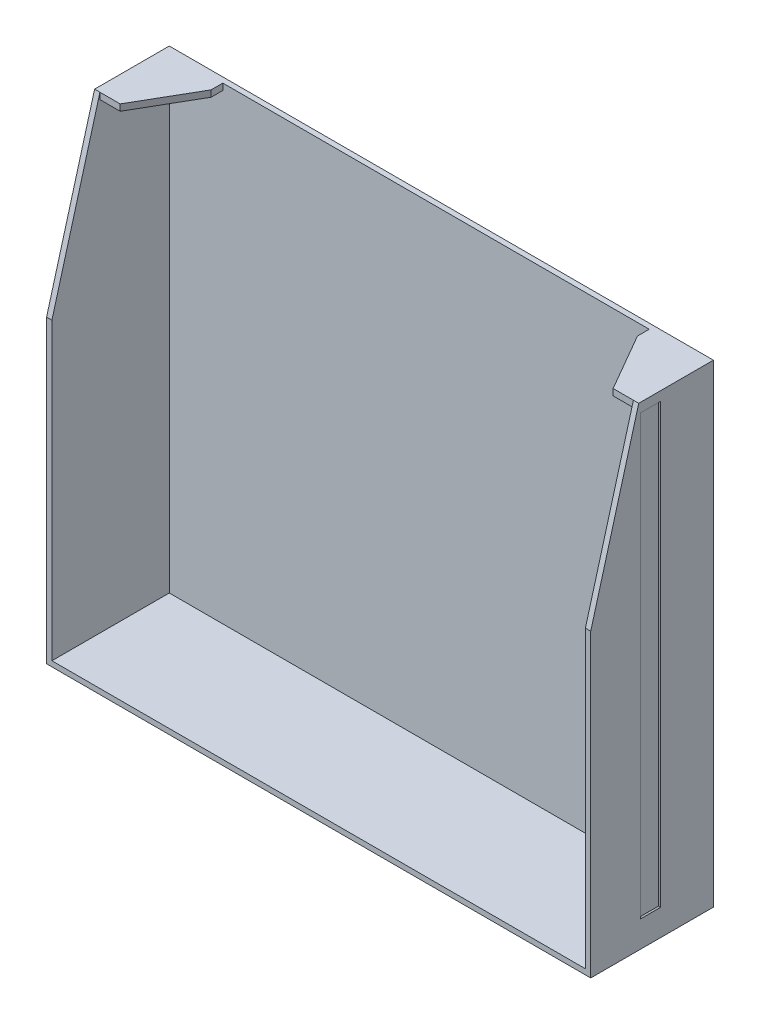
ISO-10303-21;
HEADER;
FILE_DESCRIPTION(('STEP AP214'),'2;1');
FILE_NAME('part.step','',(''),(''),'','','');
FILE_SCHEMA(('AUTOMOTIVE_DESIGN { 1 0 10303 214 1 1 1 1 }'));
ENDSEC;
DATA;
#1=APPLICATION_CONTEXT('core data for automotive mechanical design processes');
#2=APPLICATION_PROTOCOL_DEFINITION('international standard','automotive_design',2000,#1);
#3=PRODUCT_CONTEXT('',#1,'mechanical');
#4=PRODUCT('Part','Part','',(#3));
#5=PRODUCT_RELATED_PRODUCT_CATEGORY('part','',(#4));
#6=PRODUCT_DEFINITION_FORMATION('','',#4);
#7=PRODUCT_DEFINITION_CONTEXT('part definition',#1,'design');
#8=PRODUCT_DEFINITION('design','',#6,#7);
#9=PRODUCT_DEFINITION_SHAPE('','',#8);
#10=(LENGTH_UNIT() NAMED_UNIT(*) SI_UNIT(.MILLI.,.METRE.));
#11=(NAMED_UNIT(*) PLANE_ANGLE_UNIT() SI_UNIT($,.RADIAN.));
#12=(NAMED_UNIT(*) SI_UNIT($,.STERADIAN.) SOLID_ANGLE_UNIT());
#13=UNCERTAINTY_MEASURE_WITH_UNIT(LENGTH_MEASURE(1.E-05),#10,'distance_accuracy_value','');
#14=(GEOMETRIC_REPRESENTATION_CONTEXT(3) GLOBAL_UNCERTAINTY_ASSIGNED_CONTEXT((#13)) GLOBAL_UNIT_ASSIGNED_CONTEXT((#10,
#11,#12)) REPRESENTATION_CONTEXT('',''));
#15=CARTESIAN_POINT('',(0.,0.,0.));
#16=DIRECTION('',(0.,0.,1.));
#17=DIRECTION('',(1.,0.,0.));
#18=AXIS2_PLACEMENT_3D('',#15,#16,#17);
#19=CARTESIAN_POINT('',(-127.5,-111.,-2.5));
#20=DIRECTION('',(-1.,0.,0.));
#21=DIRECTION('',(0.,0.,1.));
#22=AXIS2_PLACEMENT_3D('',#19,#20,#21);
#23=PLANE('',#22);
#24=DIRECTION('',(0.,0.963748603609569,-0.266811973195743));
#25=VECTOR('',#24,1.);
#26=CARTESIAN_POINT('',(-127.5,29.7279966431385,55.));
#27=LINE('',#26,#25);
#28=CARTESIAN_POINT('',(-127.5,29.7279966431385,55.));
#29=VERTEX_POINT('',#28);
#30=CARTESIAN_POINT('',(-127.5,111.,32.5));
#31=VERTEX_POINT('',#30);
#32=EDGE_CURVE('E269',#29,#31,#27,.T.);
#33=ORIENTED_EDGE('',*,*,#32,.T.);
#34=DIRECTION('',(0.,0.,1.));
#35=VECTOR('',#34,1.);
#36=CARTESIAN_POINT('',(-127.5,111.,-2.5));
#37=LINE('',#36,#35);
#38=CARTESIAN_POINT('',(-127.5,111.,-2.5));
#39=VERTEX_POINT('',#38);
#40=EDGE_CURVE('E379',#39,#31,#37,.T.);
#41=ORIENTED_EDGE('',*,*,#40,.F.);
#42=DIRECTION('',(0.,-1.,0.));
#43=VECTOR('',#42,1.);
#44=CARTESIAN_POINT('',(-127.5,-111.,-2.5));
#45=LINE('',#44,#43);
#46=CARTESIAN_POINT('',(-127.5,-111.,-2.5));
#47=VERTEX_POINT('',#46);
#48=EDGE_CURVE('E363',#39,#47,#45,.T.);
#49=ORIENTED_EDGE('',*,*,#48,.T.);
#50=DIRECTION('',(0.,0.,1.));
#51=VECTOR('',#50,1.);
#52=CARTESIAN_POINT('',(-127.5,-111.,-2.5));
#53=LINE('',#52,#51);
#54=CARTESIAN_POINT('',(-127.5,-111.,55.));
#55=VERTEX_POINT('',#54);
#56=EDGE_CURVE('E376',#47,#55,#53,.T.);
#57=ORIENTED_EDGE('',*,*,#56,.T.);
#58=DIRECTION('',(0.,-1.,0.));
#59=VECTOR('',#58,1.);
#60=CARTESIAN_POINT('',(-127.5,0.,55.));
#61=LINE('',#60,#59);
#62=EDGE_CURVE('E333',#29,#55,#61,.T.);
#63=ORIENTED_EDGE('',*,*,#62,.F.);
#64=EDGE_LOOP('',(#33,#41,#49,#57,#63));
#65=FACE_BOUND('',#64,.T.);
#66=DIRECTION('',(0.,0.,-1.));
#67=VECTOR('',#66,1.);
#68=CARTESIAN_POINT('',(-127.5,106.7,22.8));
#69=LINE('',#68,#67);
#70=CARTESIAN_POINT('',(-127.5,106.7,31.6999999999999));
#71=VERTEX_POINT('',#70);
#72=CARTESIAN_POINT('',(-127.5,106.7,22.3));
#73=VERTEX_POINT('',#72);
#74=EDGE_CURVE('E225',#71,#73,#69,.T.);
#75=ORIENTED_EDGE('',*,*,#74,.F.);
#76=DIRECTION('',(0.,1.,0.));
#77=VECTOR('',#76,1.);
#78=CARTESIAN_POINT('',(-127.5,106.2,31.6999999999999));
#79=LINE('',#78,#77);
#80=CARTESIAN_POINT('',(-127.5,-98.6999999999998,31.6999999999999));
#81=VERTEX_POINT('',#80);
#82=EDGE_CURVE('E63',#81,#71,#79,.T.);
#83=ORIENTED_EDGE('',*,*,#82,.F.);
#84=DIRECTION('',(0.,0.,1.));
#85=VECTOR('',#84,1.);
#86=CARTESIAN_POINT('',(-127.5,-98.6999999999998,31.2));
#87=LINE('',#86,#85);
#88=CARTESIAN_POINT('',(-127.5,-98.6999999999998,22.3));
#89=VERTEX_POINT('',#88);
#90=EDGE_CURVE('E234',#89,#81,#87,.T.);
#91=ORIENTED_EDGE('',*,*,#90,.F.);
#92=DIRECTION('',(0.,-1.,0.));
#93=VECTOR('',#92,1.);
#94=CARTESIAN_POINT('',(-127.5,-98.1999999999998,22.3));
#95=LINE('',#94,#93);
#96=EDGE_CURVE('E244',#73,#89,#95,.T.);
#97=ORIENTED_EDGE('',*,*,#96,.F.);
#98=EDGE_LOOP('',(#75,#83,#91,#97));
#99=FACE_BOUND('',#98,.T.);
#100=ADVANCED_FACE('F45',(#65,#99),#23,.T.);
#101=CARTESIAN_POINT('',(0.,0.,0.));
#102=DIRECTION('',(0.,0.,-1.));
#103=DIRECTION('',(-1.,0.,0.));
#104=AXIS2_PLACEMENT_3D('',#101,#102,#103);
#105=PLANE('',#104);
#106=DIRECTION('',(0.,1.,0.));
#107=VECTOR('',#106,1.);
#108=CARTESIAN_POINT('',(-99.9115427318802,0.,0.));
#109=LINE('',#108,#107);
#110=CARTESIAN_POINT('',(-99.9115427318802,108.,0.));
#111=VERTEX_POINT('',#110);
#112=CARTESIAN_POINT('',(-99.9115427318802,111.,0.));
#113=VERTEX_POINT('',#112);
#114=EDGE_CURVE('E394',#111,#113,#109,.T.);
#115=ORIENTED_EDGE('',*,*,#114,.F.);
#116=DIRECTION('',(-1.,0.,0.));
#117=VECTOR('',#116,1.);
#118=CARTESIAN_POINT('',(0.,108.,0.));
#119=LINE('',#118,#117);
#120=CARTESIAN_POINT('',(-125.,108.,0.));
#121=VERTEX_POINT('',#120);
#122=EDGE_CURVE('E302',#111,#121,#119,.T.);
#123=ORIENTED_EDGE('',*,*,#122,.T.);
#124=DIRECTION('',(0.,-1.,0.));
#125=VECTOR('',#124,1.);
#126=CARTESIAN_POINT('',(-125.,0.,0.));
#127=LINE('',#126,#125);
#128=CARTESIAN_POINT('',(-125.,-108.5,0.));
#129=VERTEX_POINT('',#128);
#130=EDGE_CURVE('E330',#121,#129,#127,.T.);
#131=ORIENTED_EDGE('',*,*,#130,.T.);
#132=DIRECTION('',(1.,0.,0.));
#133=VECTOR('',#132,1.);
#134=CARTESIAN_POINT('',(0.,-108.5,0.));
#135=LINE('',#134,#133);
#136=CARTESIAN_POINT('',(125.,-108.5,0.));
#137=VERTEX_POINT('',#136);
#138=EDGE_CURVE('E334',#129,#137,#135,.T.);
#139=ORIENTED_EDGE('',*,*,#138,.T.);
#140=DIRECTION('',(0.,-1.,0.));
#141=VECTOR('',#140,1.);
#142=CARTESIAN_POINT('',(125.,0.,0.));
#143=LINE('',#142,#141);
#144=CARTESIAN_POINT('',(125.,108.,0.));
#145=VERTEX_POINT('',#144);
#146=EDGE_CURVE('E348',#145,#137,#143,.T.);
#147=ORIENTED_EDGE('',*,*,#146,.F.);
#148=DIRECTION('',(-1.,0.,0.));
#149=VECTOR('',#148,1.);
#150=CARTESIAN_POINT('',(0.,108.,0.));
#151=LINE('',#150,#149);
#152=CARTESIAN_POINT('',(99.9115427318802,108.,0.));
#153=VERTEX_POINT('',#152);
#154=EDGE_CURVE('E326',#145,#153,#151,.T.);
#155=ORIENTED_EDGE('',*,*,#154,.T.);
#156=DIRECTION('',(0.,1.,0.));
#157=VECTOR('',#156,1.);
#158=CARTESIAN_POINT('',(99.9115427318802,0.,0.));
#159=LINE('',#158,#157);
#160=CARTESIAN_POINT('',(99.9115427318802,111.,0.));
#161=VERTEX_POINT('',#160);
#162=EDGE_CURVE('E387',#153,#161,#159,.T.);
#163=ORIENTED_EDGE('',*,*,#162,.T.);
#164=DIRECTION('',(-1.,0.,0.));
#165=VECTOR('',#164,1.);
#166=CARTESIAN_POINT('',(-127.5,111.,0.));
#167=LINE('',#166,#165);
#168=EDGE_CURVE('E358',#161,#113,#167,.T.);
#169=ORIENTED_EDGE('',*,*,#168,.T.);
#170=EDGE_LOOP('',(#115,#123,#131,#139,#147,#155,#163,#169));
#171=FACE_BOUND('',#170,.T.);
#172=ADVANCED_FACE('F468',(#171),#105,.F.);
#173=CARTESIAN_POINT('',(-125.,0.,55.));
#174=DIRECTION('',(1.,0.,0.));
#175=DIRECTION('',(0.,1.,0.));
#176=AXIS2_PLACEMENT_3D('',#173,#174,#175);
#177=PLANE('',#176);
#178=DIRECTION('',(0.,0.963748603609569,-0.266811973195743));
#179=VECTOR('',#178,1.);
#180=CARTESIAN_POINT('',(-125.,2.11629532514875,62.6442471453156));
#181=LINE('',#180,#179);
#182=CARTESIAN_POINT('',(-125.,29.7279966431385,55.));
#183=VERTEX_POINT('',#182);
#184=CARTESIAN_POINT('',(-125.,111.,32.5));
#185=VERTEX_POINT('',#184);
#186=EDGE_CURVE('E282',#183,#185,#181,.T.);
#187=ORIENTED_EDGE('',*,*,#186,.F.);
#188=DIRECTION('',(0.,-1.,0.));
#189=VECTOR('',#188,1.);
#190=CARTESIAN_POINT('',(-125.,0.,55.));
#191=LINE('',#190,#189);
#192=CARTESIAN_POINT('',(-125.,-108.5,55.));
#193=VERTEX_POINT('',#192);
#194=EDGE_CURVE('E331',#183,#193,#191,.T.);
#195=ORIENTED_EDGE('',*,*,#194,.T.);
#196=DIRECTION('',(0.,0.,-1.));
#197=VECTOR('',#196,1.);
#198=CARTESIAN_POINT('',(-125.,-108.5,55.));
#199=LINE('',#198,#197);
#200=EDGE_CURVE('E346',#193,#129,#199,.T.);
#201=ORIENTED_EDGE('',*,*,#200,.T.);
#202=ORIENTED_EDGE('',*,*,#130,.F.);
#203=DIRECTION('',(0.,0.,-1.));
#204=VECTOR('',#203,1.);
#205=CARTESIAN_POINT('',(-125.,108.,55.));
#206=LINE('',#205,#204);
#207=CARTESIAN_POINT('',(-125.,108.,32.5));
#208=VERTEX_POINT('',#207);
#209=EDGE_CURVE('E389',#208,#121,#206,.T.);
#210=ORIENTED_EDGE('',*,*,#209,.F.);
#211=DIRECTION('',(0.,1.,0.));
#212=VECTOR('',#211,1.);
#213=CARTESIAN_POINT('',(-125.,0.,32.5));
#214=LINE('',#213,#212);
#215=EDGE_CURVE('E391',#208,#185,#214,.T.);
#216=ORIENTED_EDGE('',*,*,#215,.T.);
#217=EDGE_LOOP('',(#187,#195,#201,#202,#210,#216));
#218=FACE_BOUND('',#217,.T.);
#219=ADVANCED_FACE('F426',(#218),#177,.T.);
#220=CARTESIAN_POINT('',(127.5,-111.,-2.5));
#221=DIRECTION('',(1.,0.,0.));
#222=DIRECTION('',(0.,0.,-1.));
#223=AXIS2_PLACEMENT_3D('',#220,#221,#222);
#224=PLANE('',#223);
#225=DIRECTION('',(0.,1.,0.));
#226=VECTOR('',#225,1.);
#227=CARTESIAN_POINT('',(127.5,106.2,31.6999999999999));
#228=LINE('',#227,#226);
#229=CARTESIAN_POINT('',(127.5,-98.6999999999998,31.6999999999999));
#230=VERTEX_POINT('',#229);
#231=CARTESIAN_POINT('',(127.5,106.7,31.6999999999999));
#232=VERTEX_POINT('',#231);
#233=EDGE_CURVE('E396',#230,#232,#228,.T.);
#234=ORIENTED_EDGE('',*,*,#233,.T.);
#235=DIRECTION('',(0.,0.,-1.));
#236=VECTOR('',#235,1.);
#237=CARTESIAN_POINT('',(127.5,106.7,22.8));
#238=LINE('',#237,#236);
#239=CARTESIAN_POINT('',(127.5,106.7,22.3));
#240=VERTEX_POINT('',#239);
#241=EDGE_CURVE('E11',#232,#240,#238,.T.);
#242=ORIENTED_EDGE('',*,*,#241,.T.);
#243=DIRECTION('',(0.,-1.,0.));
#244=VECTOR('',#243,1.);
#245=CARTESIAN_POINT('',(127.5,-98.1999999999998,22.3));
#246=LINE('',#245,#244);
#247=CARTESIAN_POINT('',(127.5,-98.6999999999998,22.3));
#248=VERTEX_POINT('',#247);
#249=EDGE_CURVE('E55',#240,#248,#246,.T.);
#250=ORIENTED_EDGE('',*,*,#249,.T.);
#251=DIRECTION('',(0.,0.,1.));
#252=VECTOR('',#251,1.);
#253=CARTESIAN_POINT('',(127.5,-98.6999999999998,31.2));
#254=LINE('',#253,#252);
#255=EDGE_CURVE('E398',#248,#230,#254,.T.);
#256=ORIENTED_EDGE('',*,*,#255,.T.);
#257=EDGE_LOOP('',(#234,#242,#250,#256));
#258=FACE_BOUND('',#257,.T.);
#259=DIRECTION('',(0.,0.963748603609569,-0.266811973195743));
#260=VECTOR('',#259,1.);
#261=CARTESIAN_POINT('',(127.5,29.7279966431385,55.));
#262=LINE('',#261,#260);
#263=CARTESIAN_POINT('',(127.5,29.7279966431385,55.));
#264=VERTEX_POINT('',#263);
#265=CARTESIAN_POINT('',(127.5,111.,32.5));
#266=VERTEX_POINT('',#265);
#267=EDGE_CURVE('E267',#264,#266,#262,.T.);
#268=ORIENTED_EDGE('',*,*,#267,.F.);
#269=DIRECTION('',(0.,-1.,0.));
#270=VECTOR('',#269,1.);
#271=CARTESIAN_POINT('',(127.5,0.,55.));
#272=LINE('',#271,#270);
#273=CARTESIAN_POINT('',(127.5,-111.,55.));
#274=VERTEX_POINT('',#273);
#275=EDGE_CURVE('E339',#264,#274,#272,.T.);
#276=ORIENTED_EDGE('',*,*,#275,.T.);
#277=DIRECTION('',(0.,0.,1.));
#278=VECTOR('',#277,1.);
#279=CARTESIAN_POINT('',(127.5,-111.,-2.5));
#280=LINE('',#279,#278);
#281=CARTESIAN_POINT('',(127.5,-111.,-2.5));
#282=VERTEX_POINT('',#281);
#283=EDGE_CURVE('E372',#282,#274,#280,.T.);
#284=ORIENTED_EDGE('',*,*,#283,.F.);
#285=DIRECTION('',(0.,1.,0.));
#286=VECTOR('',#285,1.);
#287=CARTESIAN_POINT('',(127.5,-111.,-2.5));
#288=LINE('',#287,#286);
#289=CARTESIAN_POINT('',(127.5,111.,-2.5));
#290=VERTEX_POINT('',#289);
#291=EDGE_CURVE('E359',#282,#290,#288,.T.);
#292=ORIENTED_EDGE('',*,*,#291,.T.);
#293=DIRECTION('',(0.,0.,1.));
#294=VECTOR('',#293,1.);
#295=CARTESIAN_POINT('',(127.5,111.,-2.5));
#296=LINE('',#295,#294);
#297=EDGE_CURVE('E369',#290,#266,#296,.T.);
#298=ORIENTED_EDGE('',*,*,#297,.T.);
#299=EDGE_LOOP('',(#268,#276,#284,#292,#298));
#300=FACE_BOUND('',#299,.T.);
#301=ADVANCED_FACE('F422',(#258,#300),#224,.T.);
#302=CARTESIAN_POINT('',(-127.5,-111.,-2.5));
#303=DIRECTION('',(0.,-1.,0.));
#304=DIRECTION('',(0.,0.,-1.));
#305=AXIS2_PLACEMENT_3D('',#302,#303,#304);
#306=PLANE('',#305);
#307=ORIENTED_EDGE('',*,*,#283,.T.);
#308=DIRECTION('',(1.,0.,0.));
#309=VECTOR('',#308,1.);
#310=CARTESIAN_POINT('',(0.,-111.,55.));
#311=LINE('',#310,#309);
#312=EDGE_CURVE('E336',#55,#274,#311,.T.);
#313=ORIENTED_EDGE('',*,*,#312,.F.);
#314=ORIENTED_EDGE('',*,*,#56,.F.);
#315=DIRECTION('',(1.,0.,0.));
#316=VECTOR('',#315,1.);
#317=CARTESIAN_POINT('',(-127.5,-111.,-2.5));
#318=LINE('',#317,#316);
#319=EDGE_CURVE('E365',#47,#282,#318,.T.);
#320=ORIENTED_EDGE('',*,*,#319,.T.);
#321=EDGE_LOOP('',(#307,#313,#314,#320));
#322=FACE_BOUND('',#321,.T.);
#323=ADVANCED_FACE('F425',(#322),#306,.T.);
#324=CARTESIAN_POINT('',(-127.5,111.,-2.5));
#325=DIRECTION('',(0.,1.,0.));
#326=DIRECTION('',(0.,0.,1.));
#327=AXIS2_PLACEMENT_3D('',#324,#325,#326);
#328=PLANE('',#327);
#329=DIRECTION('',(1.,0.,0.));
#330=VECTOR('',#329,1.);
#331=CARTESIAN_POINT('',(-127.5,111.,32.5));
#332=LINE('',#331,#330);
#333=CARTESIAN_POINT('',(125.,111.,32.5));
#334=VERTEX_POINT('',#333);
#335=EDGE_CURVE('E277',#334,#266,#332,.T.);
#336=ORIENTED_EDGE('',*,*,#335,.T.);
#337=ORIENTED_EDGE('',*,*,#297,.F.);
#338=DIRECTION('',(-1.,0.,0.));
#339=VECTOR('',#338,1.);
#340=CARTESIAN_POINT('',(-127.5,111.,-2.5));
#341=LINE('',#340,#339);
#342=EDGE_CURVE('E361',#290,#39,#341,.T.);
#343=ORIENTED_EDGE('',*,*,#342,.T.);
#344=ORIENTED_EDGE('',*,*,#40,.T.);
#345=EDGE_CURVE('E273',#31,#185,#332,.T.);
#346=ORIENTED_EDGE('',*,*,#345,.T.);
#347=DIRECTION('',(-1.,0.,0.));
#348=VECTOR('',#347,1.);
#349=CARTESIAN_POINT('',(-127.5,111.,32.5));
#350=LINE('',#349,#348);
#351=CARTESIAN_POINT('',(-115.5,111.,32.5));
#352=VERTEX_POINT('',#351);
#353=EDGE_CURVE('E284',#352,#185,#350,.T.);
#354=ORIENTED_EDGE('',*,*,#353,.F.);
#355=DIRECTION('',(-0.499999999999998,0.,0.86602540378444));
#356=VECTOR('',#355,1.);
#357=CARTESIAN_POINT('',(-115.5,111.,32.5));
#358=LINE('',#357,#356);
#359=CARTESIAN_POINT('',(-99.9115427318802,111.,5.5));
#360=VERTEX_POINT('',#359);
#361=EDGE_CURVE('E296',#360,#352,#358,.T.);
#362=ORIENTED_EDGE('',*,*,#361,.F.);
#363=DIRECTION('',(0.,0.,1.));
#364=VECTOR('',#363,1.);
#365=CARTESIAN_POINT('',(-99.9115427318802,111.,5.5));
#366=LINE('',#365,#364);
#367=EDGE_CURVE('E289',#113,#360,#366,.T.);
#368=ORIENTED_EDGE('',*,*,#367,.F.);
#369=ORIENTED_EDGE('',*,*,#168,.F.);
#370=DIRECTION('',(0.,0.,1.));
#371=VECTOR('',#370,1.);
#372=CARTESIAN_POINT('',(99.9115427318802,111.,5.5));
#373=LINE('',#372,#371);
#374=CARTESIAN_POINT('',(99.9115427318802,111.,5.5));
#375=VERTEX_POINT('',#374);
#376=EDGE_CURVE('E307',#161,#375,#373,.T.);
#377=ORIENTED_EDGE('',*,*,#376,.T.);
#378=DIRECTION('',(0.499999999999998,0.,0.86602540378444));
#379=VECTOR('',#378,1.);
#380=CARTESIAN_POINT('',(115.5,111.,32.5));
#381=LINE('',#380,#379);
#382=CARTESIAN_POINT('',(115.5,111.,32.5));
#383=VERTEX_POINT('',#382);
#384=EDGE_CURVE('E319',#375,#383,#381,.T.);
#385=ORIENTED_EDGE('',*,*,#384,.T.);
#386=DIRECTION('',(1.,0.,0.));
#387=VECTOR('',#386,1.);
#388=CARTESIAN_POINT('',(127.5,111.,32.5));
#389=LINE('',#388,#387);
#390=EDGE_CURVE('E311',#383,#334,#389,.T.);
#391=ORIENTED_EDGE('',*,*,#390,.T.);
#392=EDGE_LOOP('',(#336,#337,#343,#344,#346,#354,#362,#368,#369,#377,#385,#391));
#393=FACE_BOUND('',#392,.T.);
#394=ADVANCED_FACE('F450',(#393),#328,.T.);
#395=CARTESIAN_POINT('',(0.,0.,-2.5));
#396=DIRECTION('',(0.,0.,-1.));
#397=DIRECTION('',(-1.,0.,0.));
#398=AXIS2_PLACEMENT_3D('',#395,#396,#397);
#399=PLANE('',#398);
#400=ORIENTED_EDGE('',*,*,#48,.F.);
#401=ORIENTED_EDGE('',*,*,#342,.F.);
#402=ORIENTED_EDGE('',*,*,#291,.F.);
#403=ORIENTED_EDGE('',*,*,#319,.F.);
#404=EDGE_LOOP('',(#400,#401,#402,#403));
#405=FACE_BOUND('',#404,.T.);
#406=ADVANCED_FACE('F447',(#405),#399,.T.);
#407=CARTESIAN_POINT('',(125.,0.,55.));
#408=DIRECTION('',(1.,0.,0.));
#409=DIRECTION('',(0.,1.,0.));
#410=AXIS2_PLACEMENT_3D('',#407,#408,#409);
#411=PLANE('',#410);
#412=DIRECTION('',(0.,-1.,0.));
#413=VECTOR('',#412,1.);
#414=CARTESIAN_POINT('',(125.,0.,55.));
#415=LINE('',#414,#413);
#416=CARTESIAN_POINT('',(125.,29.7279966431385,55.));
#417=VERTEX_POINT('',#416);
#418=CARTESIAN_POINT('',(125.,-108.5,55.));
#419=VERTEX_POINT('',#418);
#420=EDGE_CURVE('E341',#417,#419,#415,.T.);
#421=ORIENTED_EDGE('',*,*,#420,.F.);
#422=DIRECTION('',(0.,0.963748603609569,-0.266811973195743));
#423=VECTOR('',#422,1.);
#424=CARTESIAN_POINT('',(125.,2.11629532514878,62.6442471453156));
#425=LINE('',#424,#423);
#426=EDGE_CURVE('E276',#417,#334,#425,.T.);
#427=ORIENTED_EDGE('',*,*,#426,.T.);
#428=DIRECTION('',(0.,-1.,0.));
#429=VECTOR('',#428,1.);
#430=CARTESIAN_POINT('',(125.,0.,32.5));
#431=LINE('',#430,#429);
#432=CARTESIAN_POINT('',(125.,108.,32.5));
#433=VERTEX_POINT('',#432);
#434=EDGE_CURVE('E385',#334,#433,#431,.T.);
#435=ORIENTED_EDGE('',*,*,#434,.T.);
#436=DIRECTION('',(0.,0.,-1.));
#437=VECTOR('',#436,1.);
#438=CARTESIAN_POINT('',(125.,108.,55.));
#439=LINE('',#438,#437);
#440=EDGE_CURVE('E375',#433,#145,#439,.T.);
#441=ORIENTED_EDGE('',*,*,#440,.T.);
#442=ORIENTED_EDGE('',*,*,#146,.T.);
#443=DIRECTION('',(0.,0.,-1.));
#444=VECTOR('',#443,1.);
#445=CARTESIAN_POINT('',(125.,-108.5,55.));
#446=LINE('',#445,#444);
#447=EDGE_CURVE('E355',#419,#137,#446,.T.);
#448=ORIENTED_EDGE('',*,*,#447,.F.);
#449=EDGE_LOOP('',(#421,#427,#435,#441,#442,#448));
#450=FACE_BOUND('',#449,.T.);
#451=ADVANCED_FACE('F505',(#450),#411,.F.);
#452=CARTESIAN_POINT('',(0.,-108.5,55.));
#453=DIRECTION('',(0.,1.,0.));
#454=DIRECTION('',(-1.,0.,0.));
#455=AXIS2_PLACEMENT_3D('',#452,#453,#454);
#456=PLANE('',#455);
#457=ORIENTED_EDGE('',*,*,#138,.F.);
#458=ORIENTED_EDGE('',*,*,#200,.F.);
#459=DIRECTION('',(1.,0.,0.));
#460=VECTOR('',#459,1.);
#461=CARTESIAN_POINT('',(0.,-108.5,55.));
#462=LINE('',#461,#460);
#463=EDGE_CURVE('E343',#193,#419,#462,.T.);
#464=ORIENTED_EDGE('',*,*,#463,.T.);
#465=ORIENTED_EDGE('',*,*,#447,.T.);
#466=EDGE_LOOP('',(#457,#458,#464,#465));
#467=FACE_BOUND('',#466,.T.);
#468=ADVANCED_FACE('F463',(#467),#456,.T.);
#469=CARTESIAN_POINT('',(0.,0.,55.));
#470=DIRECTION('',(0.,0.,1.));
#471=DIRECTION('',(1.,0.,0.));
#472=AXIS2_PLACEMENT_3D('',#469,#470,#471);
#473=PLANE('',#472);
#474=DIRECTION('',(1.,0.,0.));
#475=VECTOR('',#474,1.);
#476=CARTESIAN_POINT('',(-127.5,29.7279966431385,55.));
#477=LINE('',#476,#475);
#478=EDGE_CURVE('E278',#29,#183,#477,.T.);
#479=ORIENTED_EDGE('',*,*,#478,.F.);
#480=ORIENTED_EDGE('',*,*,#62,.T.);
#481=ORIENTED_EDGE('',*,*,#312,.T.);
#482=ORIENTED_EDGE('',*,*,#275,.F.);
#483=EDGE_CURVE('E272',#417,#264,#477,.T.);
#484=ORIENTED_EDGE('',*,*,#483,.F.);
#485=ORIENTED_EDGE('',*,*,#420,.T.);
#486=ORIENTED_EDGE('',*,*,#463,.F.);
#487=ORIENTED_EDGE('',*,*,#194,.F.);
#488=EDGE_LOOP('',(#479,#480,#481,#482,#484,#485,#486,#487));
#489=FACE_BOUND('',#488,.T.);
#490=ADVANCED_FACE('F436',(#489),#473,.T.);
#491=CARTESIAN_POINT('',(99.9115427318802,108.,5.5));
#492=DIRECTION('',(-1.,0.,0.));
#493=DIRECTION('',(0.,0.,1.));
#494=AXIS2_PLACEMENT_3D('',#491,#492,#493);
#495=PLANE('',#494);
#496=ORIENTED_EDGE('',*,*,#162,.F.);
#497=DIRECTION('',(0.,0.,1.));
#498=VECTOR('',#497,1.);
#499=CARTESIAN_POINT('',(99.9115427318802,108.,5.5));
#500=LINE('',#499,#498);
#501=CARTESIAN_POINT('',(99.9115427318802,108.,5.5));
#502=VERTEX_POINT('',#501);
#503=EDGE_CURVE('E308',#153,#502,#500,.T.);
#504=ORIENTED_EDGE('',*,*,#503,.T.);
#505=DIRECTION('',(0.,1.,0.));
#506=VECTOR('',#505,1.);
#507=CARTESIAN_POINT('',(99.9115427318802,108.,5.5));
#508=LINE('',#507,#506);
#509=EDGE_CURVE('E317',#502,#375,#508,.T.);
#510=ORIENTED_EDGE('',*,*,#509,.T.);
#511=ORIENTED_EDGE('',*,*,#376,.F.);
#512=EDGE_LOOP('',(#496,#504,#510,#511));
#513=FACE_BOUND('',#512,.T.);
#514=ADVANCED_FACE('F491',(#513),#495,.T.);
#515=CARTESIAN_POINT('',(127.5,108.,32.5));
#516=DIRECTION('',(0.,0.,1.));
#517=DIRECTION('',(1.,0.,0.));
#518=AXIS2_PLACEMENT_3D('',#515,#516,#517);
#519=PLANE('',#518);
#520=ORIENTED_EDGE('',*,*,#434,.F.);
#521=ORIENTED_EDGE('',*,*,#390,.F.);
#522=DIRECTION('',(0.,1.,0.));
#523=VECTOR('',#522,1.);
#524=CARTESIAN_POINT('',(115.5,108.,32.5));
#525=LINE('',#524,#523);
#526=CARTESIAN_POINT('',(115.5,108.,32.5));
#527=VERTEX_POINT('',#526);
#528=EDGE_CURVE('E324',#527,#383,#525,.T.);
#529=ORIENTED_EDGE('',*,*,#528,.F.);
#530=DIRECTION('',(1.,0.,0.));
#531=VECTOR('',#530,1.);
#532=CARTESIAN_POINT('',(127.5,108.,32.5));
#533=LINE('',#532,#531);
#534=EDGE_CURVE('E314',#527,#433,#533,.T.);
#535=ORIENTED_EDGE('',*,*,#534,.T.);
#536=EDGE_LOOP('',(#520,#521,#529,#535));
#537=FACE_BOUND('',#536,.T.);
#538=ADVANCED_FACE('F501',(#537),#519,.T.);
#539=CARTESIAN_POINT('',(0.,108.,0.));
#540=DIRECTION('',(0.,-1.,0.));
#541=DIRECTION('',(0.,0.,-1.));
#542=AXIS2_PLACEMENT_3D('',#539,#540,#541);
#543=PLANE('',#542);
#544=ORIENTED_EDGE('',*,*,#154,.F.);
#545=ORIENTED_EDGE('',*,*,#440,.F.);
#546=ORIENTED_EDGE('',*,*,#534,.F.);
#547=DIRECTION('',(0.499999999999998,0.,0.86602540378444));
#548=VECTOR('',#547,1.);
#549=CARTESIAN_POINT('',(115.5,108.,32.5));
#550=LINE('',#549,#548);
#551=EDGE_CURVE('E310',#502,#527,#550,.T.);
#552=ORIENTED_EDGE('',*,*,#551,.F.);
#553=ORIENTED_EDGE('',*,*,#503,.F.);
#554=EDGE_LOOP('',(#544,#545,#546,#552,#553));
#555=FACE_BOUND('',#554,.T.);
#556=ADVANCED_FACE('F507',(#555),#543,.T.);
#557=CARTESIAN_POINT('',(115.5,108.,32.5));
#558=DIRECTION('',(-0.86602540378444,0.,0.499999999999998));
#559=DIRECTION('',(0.499999999999998,0.,0.86602540378444));
#560=AXIS2_PLACEMENT_3D('',#557,#558,#559);
#561=PLANE('',#560);
#562=ORIENTED_EDGE('',*,*,#384,.F.);
#563=ORIENTED_EDGE('',*,*,#509,.F.);
#564=ORIENTED_EDGE('',*,*,#551,.T.);
#565=ORIENTED_EDGE('',*,*,#528,.T.);
#566=EDGE_LOOP('',(#562,#563,#564,#565));
#567=FACE_BOUND('',#566,.T.);
#568=ADVANCED_FACE('F497',(#567),#561,.T.);
#569=CARTESIAN_POINT('',(-99.9115427318802,108.,5.5));
#570=DIRECTION('',(-1.,0.,0.));
#571=DIRECTION('',(0.,0.,1.));
#572=AXIS2_PLACEMENT_3D('',#569,#570,#571);
#573=PLANE('',#572);
#574=DIRECTION('',(0.,0.,1.));
#575=VECTOR('',#574,1.);
#576=CARTESIAN_POINT('',(-99.9115427318802,108.,5.5));
#577=LINE('',#576,#575);
#578=CARTESIAN_POINT('',(-99.9115427318802,108.,5.5));
#579=VERTEX_POINT('',#578);
#580=EDGE_CURVE('E291',#111,#579,#577,.T.);
#581=ORIENTED_EDGE('',*,*,#580,.F.);
#582=ORIENTED_EDGE('',*,*,#114,.T.);
#583=ORIENTED_EDGE('',*,*,#367,.T.);
#584=DIRECTION('',(0.,1.,0.));
#585=VECTOR('',#584,1.);
#586=CARTESIAN_POINT('',(-99.9115427318802,108.,5.5));
#587=LINE('',#586,#585);
#588=EDGE_CURVE('E299',#579,#360,#587,.T.);
#589=ORIENTED_EDGE('',*,*,#588,.F.);
#590=EDGE_LOOP('',(#581,#582,#583,#589));
#591=FACE_BOUND('',#590,.T.);
#592=ADVANCED_FACE('F487',(#591),#573,.F.);
#593=CARTESIAN_POINT('',(0.,108.,0.));
#594=DIRECTION('',(0.,-1.,0.));
#595=DIRECTION('',(0.,0.,-1.));
#596=AXIS2_PLACEMENT_3D('',#593,#594,#595);
#597=PLANE('',#596);
#598=ORIENTED_EDGE('',*,*,#122,.F.);
#599=ORIENTED_EDGE('',*,*,#580,.T.);
#600=DIRECTION('',(-0.499999999999998,0.,0.86602540378444));
#601=VECTOR('',#600,1.);
#602=CARTESIAN_POINT('',(-115.5,108.,32.5));
#603=LINE('',#602,#601);
#604=CARTESIAN_POINT('',(-115.5,108.,32.5));
#605=VERTEX_POINT('',#604);
#606=EDGE_CURVE('E288',#579,#605,#603,.T.);
#607=ORIENTED_EDGE('',*,*,#606,.T.);
#608=DIRECTION('',(-1.,0.,0.));
#609=VECTOR('',#608,1.);
#610=CARTESIAN_POINT('',(-127.5,108.,32.5));
#611=LINE('',#610,#609);
#612=EDGE_CURVE('E285',#605,#208,#611,.T.);
#613=ORIENTED_EDGE('',*,*,#612,.T.);
#614=ORIENTED_EDGE('',*,*,#209,.T.);
#615=EDGE_LOOP('',(#598,#599,#607,#613,#614));
#616=FACE_BOUND('',#615,.T.);
#617=ADVANCED_FACE('F472',(#616),#597,.T.);
#618=CARTESIAN_POINT('',(-115.5,108.,32.5));
#619=DIRECTION('',(-0.86602540378444,0.,-0.499999999999998));
#620=DIRECTION('',(-0.499999999999998,0.,0.86602540378444));
#621=AXIS2_PLACEMENT_3D('',#618,#619,#620);
#622=PLANE('',#621);
#623=ORIENTED_EDGE('',*,*,#361,.T.);
#624=DIRECTION('',(0.,1.,0.));
#625=VECTOR('',#624,1.);
#626=CARTESIAN_POINT('',(-115.5,108.,32.5));
#627=LINE('',#626,#625);
#628=EDGE_CURVE('E293',#605,#352,#627,.T.);
#629=ORIENTED_EDGE('',*,*,#628,.F.);
#630=ORIENTED_EDGE('',*,*,#606,.F.);
#631=ORIENTED_EDGE('',*,*,#588,.T.);
#632=EDGE_LOOP('',(#623,#629,#630,#631));
#633=FACE_BOUND('',#632,.T.);
#634=ADVANCED_FACE('F484',(#633),#622,.F.);
#635=CARTESIAN_POINT('',(-127.5,108.,32.5));
#636=DIRECTION('',(0.,0.,-1.));
#637=DIRECTION('',(-1.,0.,0.));
#638=AXIS2_PLACEMENT_3D('',#635,#636,#637);
#639=PLANE('',#638);
#640=ORIENTED_EDGE('',*,*,#215,.F.);
#641=ORIENTED_EDGE('',*,*,#612,.F.);
#642=ORIENTED_EDGE('',*,*,#628,.T.);
#643=ORIENTED_EDGE('',*,*,#353,.T.);
#644=EDGE_LOOP('',(#640,#641,#642,#643));
#645=FACE_BOUND('',#644,.T.);
#646=ADVANCED_FACE('F478',(#645),#639,.F.);
#647=CARTESIAN_POINT('',(-127.5,29.7279966431385,55.));
#648=DIRECTION('',(0.,-0.266811973195743,-0.963748603609569));
#649=DIRECTION('',(0.,0.963748603609569,-0.266811973195743));
#650=AXIS2_PLACEMENT_3D('',#647,#648,#649);
#651=PLANE('',#650);
#652=ORIENTED_EDGE('',*,*,#483,.T.);
#653=ORIENTED_EDGE('',*,*,#267,.T.);
#654=ORIENTED_EDGE('',*,*,#335,.F.);
#655=ORIENTED_EDGE('',*,*,#426,.F.);
#656=EDGE_LOOP('',(#652,#653,#654,#655));
#657=FACE_BOUND('',#656,.T.);
#658=ADVANCED_FACE('F550',(#657),#651,.F.);
#659=ORIENTED_EDGE('',*,*,#186,.T.);
#660=ORIENTED_EDGE('',*,*,#345,.F.);
#661=ORIENTED_EDGE('',*,*,#32,.F.);
#662=ORIENTED_EDGE('',*,*,#478,.T.);
#663=EDGE_LOOP('',(#659,#660,#661,#662));
#664=FACE_BOUND('',#663,.T.);
#665=ADVANCED_FACE('F454',(#664),#651,.F.);
#666=CARTESIAN_POINT('',(127.,0.,0.));
#667=DIRECTION('',(-1.,0.,0.));
#668=DIRECTION('',(0.,0.,1.));
#669=AXIS2_PLACEMENT_3D('',#666,#667,#668);
#670=PLANE('',#669);
#671=DIRECTION('',(0.,0.,1.));
#672=VECTOR('',#671,1.);
#673=CARTESIAN_POINT('',(127.,-98.1999999999998,22.8));
#674=LINE('',#673,#672);
#675=CARTESIAN_POINT('',(127.,-98.1999999999998,22.8));
#676=VERTEX_POINT('',#675);
#677=CARTESIAN_POINT('',(127.,-98.1999999999998,31.2));
#678=VERTEX_POINT('',#677);
#679=EDGE_CURVE('E255',#676,#678,#674,.T.);
#680=ORIENTED_EDGE('',*,*,#679,.F.);
#681=DIRECTION('',(0.,-1.,0.));
#682=VECTOR('',#681,1.);
#683=CARTESIAN_POINT('',(127.,106.2,22.8));
#684=LINE('',#683,#682);
#685=CARTESIAN_POINT('',(127.,106.2,22.8));
#686=VERTEX_POINT('',#685);
#687=EDGE_CURVE('E263',#686,#676,#684,.T.);
#688=ORIENTED_EDGE('',*,*,#687,.F.);
#689=DIRECTION('',(0.,0.,-1.));
#690=VECTOR('',#689,1.);
#691=CARTESIAN_POINT('',(127.,106.2,31.2));
#692=LINE('',#691,#690);
#693=CARTESIAN_POINT('',(127.,106.2,31.2));
#694=VERTEX_POINT('',#693);
#695=EDGE_CURVE('E261',#694,#686,#692,.T.);
#696=ORIENTED_EDGE('',*,*,#695,.F.);
#697=DIRECTION('',(0.,1.,0.));
#698=VECTOR('',#697,1.);
#699=CARTESIAN_POINT('',(127.,-98.1999999999998,31.2));
#700=LINE('',#699,#698);
#701=EDGE_CURVE('E258',#678,#694,#700,.T.);
#702=ORIENTED_EDGE('',*,*,#701,.F.);
#703=EDGE_LOOP('',(#680,#688,#696,#702));
#704=FACE_BOUND('',#703,.T.);
#705=ADVANCED_FACE('F418',(#704),#670,.F.);
#706=CARTESIAN_POINT('',(127.5,-98.6999999999998,-2.5));
#707=DIRECTION('',(0.707106781186548,0.707106781186548,0.));
#708=DIRECTION('',(0.,0.,-1.));
#709=AXIS2_PLACEMENT_3D('',#706,#707,#708);
#710=PLANE('',#709);
#711=DIRECTION('',(-0.577350269189625,0.577350269189625,0.577350269189627));
#712=VECTOR('',#711,1.);
#713=CARTESIAN_POINT('',(131.6,-102.8,18.2));
#714=LINE('',#713,#712);
#715=EDGE_CURVE('E404',#676,#248,#714,.F.);
#716=ORIENTED_EDGE('',*,*,#715,.F.);
#717=ORIENTED_EDGE('',*,*,#679,.T.);
#718=DIRECTION('',(-0.577350269189626,0.577350269189626,-0.577350269189625));
#719=VECTOR('',#718,1.);
#720=CARTESIAN_POINT('',(116.1,-87.2999999999998,20.3));
#721=LINE('',#720,#719);
#722=EDGE_CURVE('E50',#230,#678,#721,.T.);
#723=ORIENTED_EDGE('',*,*,#722,.F.);
#724=ORIENTED_EDGE('',*,*,#255,.F.);
#725=EDGE_LOOP('',(#716,#717,#723,#724));
#726=FACE_BOUND('',#725,.T.);
#727=ADVANCED_FACE('F48',(#726),#710,.T.);
#728=CARTESIAN_POINT('',(127.5,-111.,31.6999999999999));
#729=DIRECTION('',(0.707106781186547,0.,-0.707106781186549));
#730=DIRECTION('',(0.,-1.,0.));
#731=AXIS2_PLACEMENT_3D('',#728,#729,#730);
#732=PLANE('',#731);
#733=ORIENTED_EDGE('',*,*,#722,.T.);
#734=ORIENTED_EDGE('',*,*,#701,.T.);
#735=DIRECTION('',(0.577350269189626,0.577350269189626,0.577350269189625));
#736=VECTOR('',#735,1.);
#737=CARTESIAN_POINT('',(116.1,95.3000000000002,20.3));
#738=LINE('',#737,#736);
#739=EDGE_CURVE('E403',#232,#694,#738,.F.);
#740=ORIENTED_EDGE('',*,*,#739,.F.);
#741=ORIENTED_EDGE('',*,*,#233,.F.);
#742=EDGE_LOOP('',(#733,#734,#740,#741));
#743=FACE_BOUND('',#742,.T.);
#744=ADVANCED_FACE('F412',(#743),#732,.T.);
#745=CARTESIAN_POINT('',(127.5,-111.,22.3));
#746=DIRECTION('',(0.707106781186549,0.,0.707106781186546));
#747=DIRECTION('',(0.,1.,0.));
#748=AXIS2_PLACEMENT_3D('',#745,#746,#747);
#749=PLANE('',#748);
#750=ORIENTED_EDGE('',*,*,#715,.T.);
#751=ORIENTED_EDGE('',*,*,#249,.F.);
#752=DIRECTION('',(-0.577350269189625,-0.577350269189625,0.577350269189627));
#753=VECTOR('',#752,1.);
#754=CARTESIAN_POINT('',(135.766666666667,114.966666666667,14.0333333333333));
#755=LINE('',#754,#753);
#756=EDGE_CURVE('E71',#686,#240,#755,.F.);
#757=ORIENTED_EDGE('',*,*,#756,.F.);
#758=ORIENTED_EDGE('',*,*,#687,.T.);
#759=EDGE_LOOP('',(#750,#751,#757,#758));
#760=FACE_BOUND('',#759,.T.);
#761=ADVANCED_FACE('F420',(#760),#749,.T.);
#762=CARTESIAN_POINT('',(127.5,106.7,-2.5));
#763=DIRECTION('',(0.707106781186548,-0.707106781186548,0.));
#764=DIRECTION('',(0.,0.,1.));
#765=AXIS2_PLACEMENT_3D('',#762,#763,#764);
#766=PLANE('',#765);
#767=ORIENTED_EDGE('',*,*,#739,.T.);
#768=ORIENTED_EDGE('',*,*,#695,.T.);
#769=ORIENTED_EDGE('',*,*,#756,.T.);
#770=ORIENTED_EDGE('',*,*,#241,.F.);
#771=EDGE_LOOP('',(#767,#768,#769,#770));
#772=FACE_BOUND('',#771,.T.);
#773=ADVANCED_FACE('F419',(#772),#766,.T.);
#774=CARTESIAN_POINT('',(-127.,0.,0.));
#775=DIRECTION('',(1.,0.,0.));
#776=DIRECTION('',(0.,0.,1.));
#777=AXIS2_PLACEMENT_3D('',#774,#775,#776);
#778=PLANE('',#777);
#779=DIRECTION('',(0.,0.,1.));
#780=VECTOR('',#779,1.);
#781=CARTESIAN_POINT('',(-127.,-98.1999999999998,22.8));
#782=LINE('',#781,#780);
#783=CARTESIAN_POINT('',(-127.,-98.1999999999998,22.8));
#784=VERTEX_POINT('',#783);
#785=CARTESIAN_POINT('',(-127.,-98.1999999999998,31.2));
#786=VERTEX_POINT('',#785);
#787=EDGE_CURVE('E233',#784,#786,#782,.T.);
#788=ORIENTED_EDGE('',*,*,#787,.T.);
#789=DIRECTION('',(0.,1.,0.));
#790=VECTOR('',#789,1.);
#791=CARTESIAN_POINT('',(-127.,-98.1999999999998,31.2));
#792=LINE('',#791,#790);
#793=CARTESIAN_POINT('',(-127.,106.2,31.2));
#794=VERTEX_POINT('',#793);
#795=EDGE_CURVE('E218',#786,#794,#792,.T.);
#796=ORIENTED_EDGE('',*,*,#795,.T.);
#797=DIRECTION('',(0.,0.,-1.));
#798=VECTOR('',#797,1.);
#799=CARTESIAN_POINT('',(-127.,106.2,31.2));
#800=LINE('',#799,#798);
#801=CARTESIAN_POINT('',(-127.,106.2,22.8));
#802=VERTEX_POINT('',#801);
#803=EDGE_CURVE('E224',#794,#802,#800,.T.);
#804=ORIENTED_EDGE('',*,*,#803,.T.);
#805=DIRECTION('',(0.,-1.,0.));
#806=VECTOR('',#805,1.);
#807=CARTESIAN_POINT('',(-127.,106.2,22.8));
#808=LINE('',#807,#806);
#809=EDGE_CURVE('E247',#802,#784,#808,.T.);
#810=ORIENTED_EDGE('',*,*,#809,.T.);
#811=EDGE_LOOP('',(#788,#796,#804,#810));
#812=FACE_BOUND('',#811,.T.);
#813=ADVANCED_FACE('F229',(#812),#778,.F.);
#814=CARTESIAN_POINT('',(-127.5,-111.,31.6999999999999));
#815=DIRECTION('',(-0.707106781186547,0.,-0.707106781186549));
#816=DIRECTION('',(0.,-1.,0.));
#817=AXIS2_PLACEMENT_3D('',#814,#815,#816);
#818=PLANE('',#817);
#819=DIRECTION('',(0.577350269189626,0.577350269189626,-0.577350269189625));
#820=VECTOR('',#819,1.);
#821=CARTESIAN_POINT('',(-116.1,-87.2999999999998,20.3));
#822=LINE('',#821,#820);
#823=EDGE_CURVE('E250',#81,#786,#822,.T.);
#824=ORIENTED_EDGE('',*,*,#823,.F.);
#825=ORIENTED_EDGE('',*,*,#82,.T.);
#826=DIRECTION('',(-0.577350269189626,0.577350269189626,0.577350269189625));
#827=VECTOR('',#826,1.);
#828=CARTESIAN_POINT('',(-116.1,95.3000000000002,20.3));
#829=LINE('',#828,#827);
#830=EDGE_CURVE('E215',#71,#794,#829,.F.);
#831=ORIENTED_EDGE('',*,*,#830,.T.);
#832=ORIENTED_EDGE('',*,*,#795,.F.);
#833=EDGE_LOOP('',(#824,#825,#831,#832));
#834=FACE_BOUND('',#833,.T.);
#835=ADVANCED_FACE('F217',(#834),#818,.T.);
#836=CARTESIAN_POINT('',(-127.5,-98.6999999999998,-2.5));
#837=DIRECTION('',(-0.707106781186548,0.707106781186548,0.));
#838=DIRECTION('',(0.,0.,-1.));
#839=AXIS2_PLACEMENT_3D('',#836,#837,#838);
#840=PLANE('',#839);
#841=DIRECTION('',(0.577350269189625,0.577350269189625,0.577350269189627));
#842=VECTOR('',#841,1.);
#843=CARTESIAN_POINT('',(-131.6,-102.8,18.2));
#844=LINE('',#843,#842);
#845=EDGE_CURVE('E239',#784,#89,#844,.F.);
#846=ORIENTED_EDGE('',*,*,#845,.T.);
#847=ORIENTED_EDGE('',*,*,#90,.T.);
#848=ORIENTED_EDGE('',*,*,#823,.T.);
#849=ORIENTED_EDGE('',*,*,#787,.F.);
#850=EDGE_LOOP('',(#846,#847,#848,#849));
#851=FACE_BOUND('',#850,.T.);
#852=ADVANCED_FACE('F632',(#851),#840,.T.);
#853=CARTESIAN_POINT('',(-127.5,-111.,22.3));
#854=DIRECTION('',(-0.707106781186549,0.,0.707106781186546));
#855=DIRECTION('',(0.,1.,0.));
#856=AXIS2_PLACEMENT_3D('',#853,#854,#855);
#857=PLANE('',#856);
#858=ORIENTED_EDGE('',*,*,#845,.F.);
#859=ORIENTED_EDGE('',*,*,#809,.F.);
#860=DIRECTION('',(0.577350269189625,-0.577350269189625,0.577350269189627));
#861=VECTOR('',#860,1.);
#862=CARTESIAN_POINT('',(-135.766666666667,114.966666666667,14.0333333333333));
#863=LINE('',#862,#861);
#864=EDGE_CURVE('E237',#802,#73,#863,.F.);
#865=ORIENTED_EDGE('',*,*,#864,.T.);
#866=ORIENTED_EDGE('',*,*,#96,.T.);
#867=EDGE_LOOP('',(#858,#859,#865,#866));
#868=FACE_BOUND('',#867,.T.);
#869=ADVANCED_FACE('F641',(#868),#857,.T.);
#870=CARTESIAN_POINT('',(-127.5,106.7,-2.5));
#871=DIRECTION('',(-0.707106781186548,-0.707106781186548,0.));
#872=DIRECTION('',(0.,0.,1.));
#873=AXIS2_PLACEMENT_3D('',#870,#871,#872);
#874=PLANE('',#873);
#875=ORIENTED_EDGE('',*,*,#830,.F.);
#876=ORIENTED_EDGE('',*,*,#74,.T.);
#877=ORIENTED_EDGE('',*,*,#864,.F.);
#878=ORIENTED_EDGE('',*,*,#803,.F.);
#879=EDGE_LOOP('',(#875,#876,#877,#878));
#880=FACE_BOUND('',#879,.T.);
#881=ADVANCED_FACE('F236',(#880),#874,.T.);
#882=CLOSED_SHELL('',(#100,#172,#219,#301,#323,#394,#406,#451,#468,#490,#514,#538,#556,#568,
#592,#617,#634,#646,#658,#665,#705,#727,#744,#761,#773,#813,#835,#852,#869,#881));
#883=MANIFOLD_SOLID_BREP('B2',#882);
#884=ADVANCED_BREP_SHAPE_REPRESENTATION('',(#18,#883),#14);
#885=SHAPE_DEFINITION_REPRESENTATION(#9,#884);
ENDSEC;
END-ISO-10303-21;
